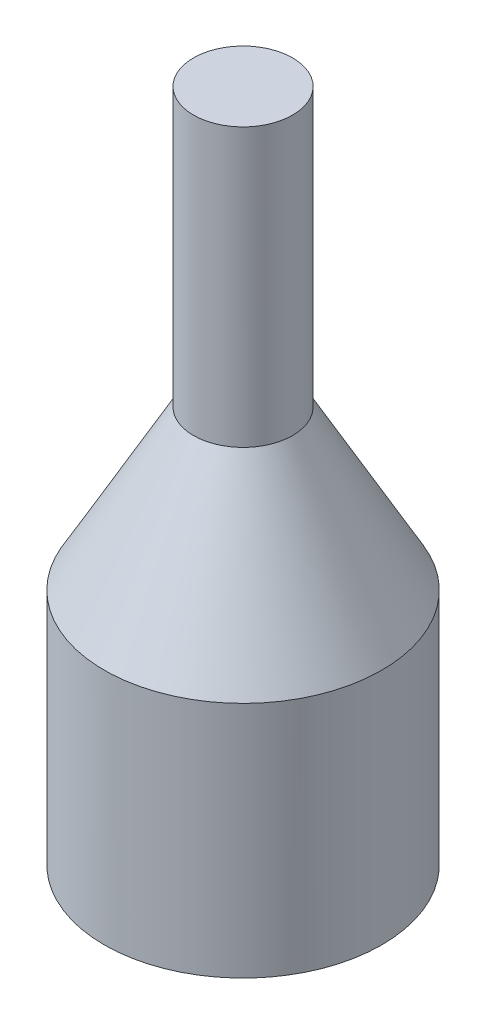
ISO-10303-21;
HEADER;
FILE_DESCRIPTION(('STEP AP214'),'2;1');
FILE_NAME('part.step','',(''),(''),'','','');
FILE_SCHEMA(('AUTOMOTIVE_DESIGN { 1 0 10303 214 1 1 1 1 }'));
ENDSEC;
DATA;
#1=APPLICATION_CONTEXT('core data for automotive mechanical design processes');
#2=APPLICATION_PROTOCOL_DEFINITION('international standard','automotive_design',2000,#1);
#3=PRODUCT_CONTEXT('',#1,'mechanical');
#4=PRODUCT('Part','Part','',(#3));
#5=PRODUCT_RELATED_PRODUCT_CATEGORY('part','',(#4));
#6=PRODUCT_DEFINITION_FORMATION('','',#4);
#7=PRODUCT_DEFINITION_CONTEXT('part definition',#1,'design');
#8=PRODUCT_DEFINITION('design','',#6,#7);
#9=PRODUCT_DEFINITION_SHAPE('','',#8);
#10=(LENGTH_UNIT() NAMED_UNIT(*) SI_UNIT(.MILLI.,.METRE.));
#11=(NAMED_UNIT(*) PLANE_ANGLE_UNIT() SI_UNIT($,.RADIAN.));
#12=(NAMED_UNIT(*) SI_UNIT($,.STERADIAN.) SOLID_ANGLE_UNIT());
#13=UNCERTAINTY_MEASURE_WITH_UNIT(LENGTH_MEASURE(1.E-05),#10,'distance_accuracy_value','');
#14=(GEOMETRIC_REPRESENTATION_CONTEXT(3) GLOBAL_UNCERTAINTY_ASSIGNED_CONTEXT((#13)) GLOBAL_UNIT_ASSIGNED_CONTEXT((#10,
#11,#12)) REPRESENTATION_CONTEXT('',''));
#15=CARTESIAN_POINT('',(0.,0.,0.));
#16=DIRECTION('',(0.,0.,1.));
#17=DIRECTION('',(1.,0.,0.));
#18=AXIS2_PLACEMENT_3D('',#15,#16,#17);
#19=CARTESIAN_POINT('',(0.,12.,0.));
#20=DIRECTION('',(0.,-1.,0.));
#21=DIRECTION('',(0.,0.,-1.));
#22=AXIS2_PLACEMENT_3D('',#19,#20,#21);
#23=CYLINDRICAL_SURFACE('',#22,7.);
#24=CARTESIAN_POINT('',(0.,12.,0.));
#25=DIRECTION('',(0.,-1.,0.));
#26=DIRECTION('',(0.,0.,-1.));
#27=AXIS2_PLACEMENT_3D('',#24,#25,#26);
#28=CIRCLE('',#27,7.);
#29=CARTESIAN_POINT('',(0.,12.,-7.));
#30=VERTEX_POINT('',#29);
#31=EDGE_CURVE('E11',#30,#30,#28,.F.);
#32=ORIENTED_EDGE('',*,*,#31,.F.);
#33=EDGE_LOOP('',(#32));
#34=FACE_BOUND('',#33,.T.);
#35=CARTESIAN_POINT('',(0.,0.,0.));
#36=DIRECTION('',(0.,1.,0.));
#37=DIRECTION('',(0.,0.,1.));
#38=AXIS2_PLACEMENT_3D('',#35,#36,#37);
#39=CIRCLE('',#38,7.);
#40=CARTESIAN_POINT('',(0.,0.,7.));
#41=VERTEX_POINT('',#40);
#42=EDGE_CURVE('E42',#41,#41,#39,.T.);
#43=ORIENTED_EDGE('',*,*,#42,.T.);
#44=EDGE_LOOP('',(#43));
#45=FACE_BOUND('',#44,.T.);
#46=ADVANCED_FACE('F34',(#34,#45),#23,.T.);
#47=CARTESIAN_POINT('',(0.,0.,0.));
#48=DIRECTION('',(0.,1.,0.));
#49=DIRECTION('',(0.,0.,1.));
#50=AXIS2_PLACEMENT_3D('',#47,#48,#49);
#51=PLANE('',#50);
#52=CARTESIAN_POINT('',(0.,0.,0.));
#53=DIRECTION('',(0.,-1.,0.));
#54=DIRECTION('',(0.,0.,-1.));
#55=AXIS2_PLACEMENT_3D('',#52,#53,#54);
#56=CIRCLE('',#55,4.);
#57=CARTESIAN_POINT('',(0.,0.,-4.));
#58=VERTEX_POINT('',#57);
#59=EDGE_CURVE('E90',#58,#58,#56,.T.);
#60=ORIENTED_EDGE('',*,*,#59,.F.);
#61=EDGE_LOOP('',(#60));
#62=FACE_BOUND('',#61,.T.);
#63=ORIENTED_EDGE('',*,*,#42,.F.);
#64=EDGE_LOOP('',(#63));
#65=FACE_BOUND('',#64,.T.);
#66=ADVANCED_FACE('F73',(#62,#65),#51,.F.);
#67=CARTESIAN_POINT('',(0.,20.,0.));
#68=DIRECTION('',(0.,-1.,0.));
#69=DIRECTION('',(0.,0.,-1.));
#70=AXIS2_PLACEMENT_3D('',#67,#68,#69);
#71=CONICAL_SURFACE('',#70,2.5,0.512389460310738);
#72=CARTESIAN_POINT('',(0.,20.,0.));
#73=DIRECTION('',(0.,1.,0.));
#74=DIRECTION('',(0.,0.,1.));
#75=AXIS2_PLACEMENT_3D('',#72,#73,#74);
#76=CIRCLE('',#75,2.5);
#77=CARTESIAN_POINT('',(0.,20.,2.5));
#78=VERTEX_POINT('',#77);
#79=EDGE_CURVE('E37',#78,#78,#76,.T.);
#80=ORIENTED_EDGE('',*,*,#79,.F.);
#81=EDGE_LOOP('',(#80));
#82=FACE_BOUND('',#81,.T.);
#83=ORIENTED_EDGE('',*,*,#31,.T.);
#84=EDGE_LOOP('',(#83));
#85=FACE_BOUND('',#84,.T.);
#86=ADVANCED_FACE('F68',(#82,#85),#71,.T.);
#87=CARTESIAN_POINT('',(0.,34.,0.));
#88=DIRECTION('',(0.,-1.,0.));
#89=DIRECTION('',(0.,0.,-1.));
#90=AXIS2_PLACEMENT_3D('',#87,#88,#89);
#91=CYLINDRICAL_SURFACE('',#90,2.5);
#92=CARTESIAN_POINT('',(0.,34.,0.));
#93=DIRECTION('',(0.,1.,0.));
#94=DIRECTION('',(0.,0.,1.));
#95=AXIS2_PLACEMENT_3D('',#92,#93,#94);
#96=CIRCLE('',#95,2.5);
#97=CARTESIAN_POINT('',(0.,34.,2.5));
#98=VERTEX_POINT('',#97);
#99=EDGE_CURVE('E86',#98,#98,#96,.T.);
#100=ORIENTED_EDGE('',*,*,#99,.F.);
#101=EDGE_LOOP('',(#100));
#102=FACE_BOUND('',#101,.T.);
#103=ORIENTED_EDGE('',*,*,#79,.T.);
#104=EDGE_LOOP('',(#103));
#105=FACE_BOUND('',#104,.T.);
#106=ADVANCED_FACE('F57',(#102,#105),#91,.T.);
#107=CARTESIAN_POINT('',(0.,34.,0.));
#108=DIRECTION('',(0.,1.,0.));
#109=DIRECTION('',(0.,0.,1.));
#110=AXIS2_PLACEMENT_3D('',#107,#108,#109);
#111=PLANE('',#110);
#112=ORIENTED_EDGE('',*,*,#99,.T.);
#113=EDGE_LOOP('',(#112));
#114=FACE_BOUND('',#113,.T.);
#115=ADVANCED_FACE('F67',(#114),#111,.T.);
#116=CARTESIAN_POINT('',(0.,14.,0.));
#117=DIRECTION('',(0.,-1.,0.));
#118=DIRECTION('',(0.,0.,-1.));
#119=AXIS2_PLACEMENT_3D('',#116,#117,#118);
#120=CYLINDRICAL_SURFACE('',#119,4.);
#121=CARTESIAN_POINT('',(0.,14.,0.));
#122=DIRECTION('',(0.,-1.,0.));
#123=DIRECTION('',(0.,0.,-1.));
#124=AXIS2_PLACEMENT_3D('',#121,#122,#123);
#125=CIRCLE('',#124,4.);
#126=CARTESIAN_POINT('',(0.,14.,-4.));
#127=VERTEX_POINT('',#126);
#128=EDGE_CURVE('E89',#127,#127,#125,.T.);
#129=ORIENTED_EDGE('',*,*,#128,.F.);
#130=EDGE_LOOP('',(#129));
#131=FACE_BOUND('',#130,.T.);
#132=ORIENTED_EDGE('',*,*,#59,.T.);
#133=EDGE_LOOP('',(#132));
#134=FACE_BOUND('',#133,.T.);
#135=ADVANCED_FACE('F98',(#131,#134),#120,.F.);
#136=CARTESIAN_POINT('',(0.,14.,0.));
#137=DIRECTION('',(0.,-1.,0.));
#138=DIRECTION('',(0.,0.,-1.));
#139=AXIS2_PLACEMENT_3D('',#136,#137,#138);
#140=PLANE('',#139);
#141=ORIENTED_EDGE('',*,*,#128,.T.);
#142=EDGE_LOOP('',(#141));
#143=FACE_BOUND('',#142,.T.);
#144=ADVANCED_FACE('F96',(#143),#140,.T.);
#145=CLOSED_SHELL('',(#46,#66,#86,#106,#115,#135,#144));
#146=MANIFOLD_SOLID_BREP('B2',#145);
#147=ADVANCED_BREP_SHAPE_REPRESENTATION('',(#18,#146),#14);
#148=SHAPE_DEFINITION_REPRESENTATION(#9,#147);
ENDSEC;
END-ISO-10303-21;
